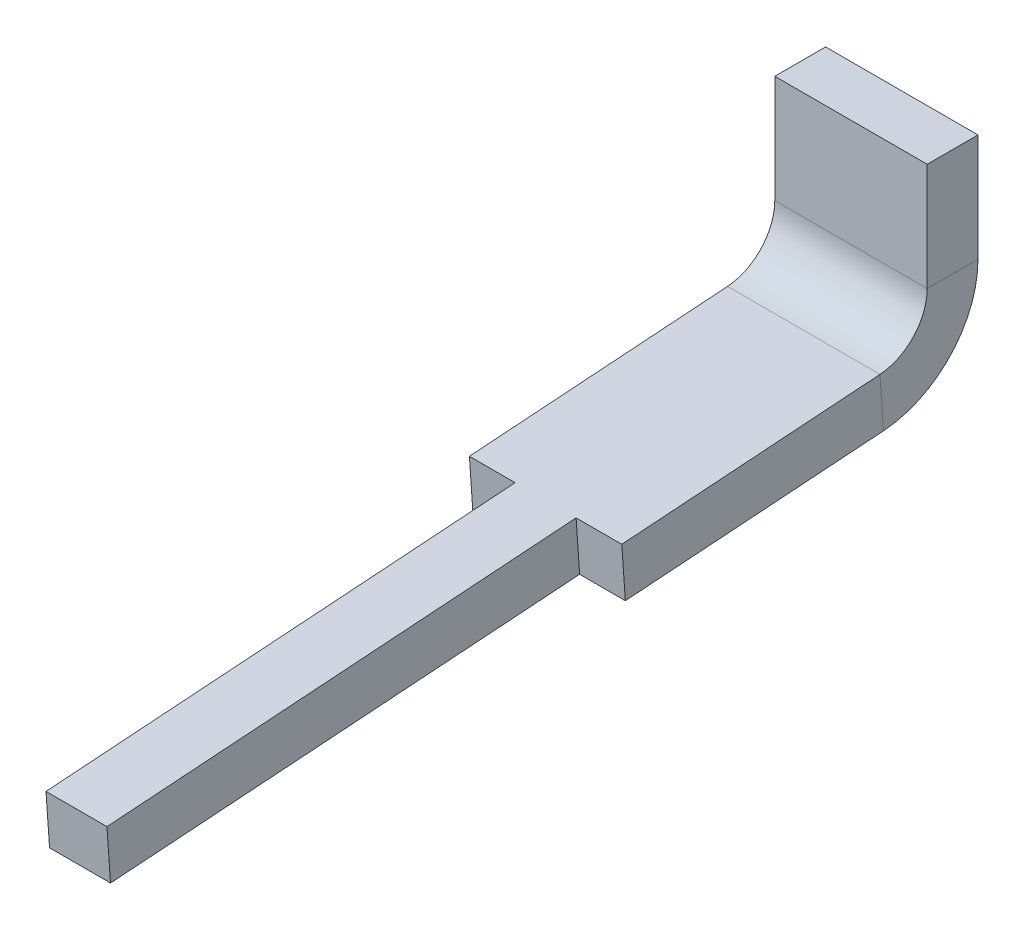
ISO-10303-21;
HEADER;
FILE_DESCRIPTION(('STEP AP214'),'2;1');
FILE_NAME('part.step','',(''),(''),'','','');
FILE_SCHEMA(('AUTOMOTIVE_DESIGN { 1 0 10303 214 1 1 1 1 }'));
ENDSEC;
DATA;
#1=APPLICATION_CONTEXT('core data for automotive mechanical design processes');
#2=APPLICATION_PROTOCOL_DEFINITION('international standard','automotive_design',2000,#1);
#3=PRODUCT_CONTEXT('',#1,'mechanical');
#4=PRODUCT('Part','Part','',(#3));
#5=PRODUCT_RELATED_PRODUCT_CATEGORY('part','',(#4));
#6=PRODUCT_DEFINITION_FORMATION('','',#4);
#7=PRODUCT_DEFINITION_CONTEXT('part definition',#1,'design');
#8=PRODUCT_DEFINITION('design','',#6,#7);
#9=PRODUCT_DEFINITION_SHAPE('','',#8);
#10=(LENGTH_UNIT() NAMED_UNIT(*) SI_UNIT(.MILLI.,.METRE.));
#11=(NAMED_UNIT(*) PLANE_ANGLE_UNIT() SI_UNIT($,.RADIAN.));
#12=(NAMED_UNIT(*) SI_UNIT($,.STERADIAN.) SOLID_ANGLE_UNIT());
#13=UNCERTAINTY_MEASURE_WITH_UNIT(LENGTH_MEASURE(1.E-05),#10,'distance_accuracy_value','');
#14=(GEOMETRIC_REPRESENTATION_CONTEXT(3) GLOBAL_UNCERTAINTY_ASSIGNED_CONTEXT((#13)) GLOBAL_UNIT_ASSIGNED_CONTEXT((#10,
#11,#12)) REPRESENTATION_CONTEXT('',''));
#15=CARTESIAN_POINT('',(0.,0.,0.));
#16=DIRECTION('',(0.,0.,1.));
#17=DIRECTION('',(1.,0.,0.));
#18=AXIS2_PLACEMENT_3D('',#15,#16,#17);
#19=CARTESIAN_POINT('',(3.88578058618805E-13,-2.2413203435652,-0.01));
#20=DIRECTION('',(0.,-1.,0.));
#21=DIRECTION('',(1.,0.,0.));
#22=AXIS2_PLACEMENT_3D('',#19,#20,#21);
#23=PLANE('',#22);
#24=DIRECTION('',(1.,0.,0.));
#25=VECTOR('',#24,1.);
#26=CARTESIAN_POINT('',(0.,-2.2413203435652,0.5));
#27=LINE('',#26,#25);
#28=CARTESIAN_POINT('',(33.1099999999967,-2.2413203435653,0.5));
#29=VERTEX_POINT('',#28);
#30=CARTESIAN_POINT('',(34.6100000000004,-2.2413203435653,0.5));
#31=VERTEX_POINT('',#30);
#32=EDGE_CURVE('E11',#29,#31,#27,.T.);
#33=ORIENTED_EDGE('',*,*,#32,.T.);
#34=DIRECTION('',(0.,0.,1.));
#35=VECTOR('',#34,1.);
#36=CARTESIAN_POINT('',(34.6100000000004,-2.2413203435653,0.5));
#37=LINE('',#36,#35);
#38=CARTESIAN_POINT('',(34.6100000000004,-2.2413203435653,0.));
#39=VERTEX_POINT('',#38);
#40=EDGE_CURVE('E24',#39,#31,#37,.T.);
#41=ORIENTED_EDGE('',*,*,#40,.F.);
#42=DIRECTION('',(1.,0.,0.));
#43=VECTOR('',#42,1.);
#44=CARTESIAN_POINT('',(0.,-2.2413203435652,0.));
#45=LINE('',#44,#43);
#46=CARTESIAN_POINT('',(33.1099999999967,-2.2413203435653,0.));
#47=VERTEX_POINT('',#46);
#48=EDGE_CURVE('E211',#47,#39,#45,.T.);
#49=ORIENTED_EDGE('',*,*,#48,.F.);
#50=DIRECTION('',(0.,0.,-1.));
#51=VECTOR('',#50,1.);
#52=CARTESIAN_POINT('',(33.1099999999967,-2.2413203435653,0.5));
#53=LINE('',#52,#51);
#54=EDGE_CURVE('E208',#29,#47,#53,.T.);
#55=ORIENTED_EDGE('',*,*,#54,.F.);
#56=EDGE_LOOP('',(#33,#41,#49,#55));
#57=FACE_BOUND('',#56,.T.);
#58=ADVANCED_FACE('F17',(#57),#23,.F.);
#59=CARTESIAN_POINT('',(33.1099999999967,0.,0.5));
#60=DIRECTION('',(1.,0.,0.));
#61=DIRECTION('',(0.,1.,0.));
#62=AXIS2_PLACEMENT_3D('',#59,#60,#61);
#63=PLANE('',#62);
#64=DIRECTION('',(0.,-1.,0.));
#65=VECTOR('',#64,1.);
#66=CARTESIAN_POINT('',(33.1099999999967,0.,0.5));
#67=LINE('',#66,#65);
#68=CARTESIAN_POINT('',(33.1099999999967,-3.3009203435652,0.5));
#69=VERTEX_POINT('',#68);
#70=EDGE_CURVE('E206',#29,#69,#67,.T.);
#71=ORIENTED_EDGE('',*,*,#70,.F.);
#72=ORIENTED_EDGE('',*,*,#54,.T.);
#73=DIRECTION('',(0.,-1.,0.));
#74=VECTOR('',#73,1.);
#75=CARTESIAN_POINT('',(33.1099999999967,0.,0.));
#76=LINE('',#75,#74);
#77=CARTESIAN_POINT('',(33.1099999999967,-3.3009203435652,0.));
#78=VERTEX_POINT('',#77);
#79=EDGE_CURVE('E204',#47,#78,#76,.T.);
#80=ORIENTED_EDGE('',*,*,#79,.T.);
#81=DIRECTION('',(0.,0.,1.));
#82=VECTOR('',#81,1.);
#83=CARTESIAN_POINT('',(33.1099999999967,-3.3009203435652,0.499999999999977));
#84=LINE('',#83,#82);
#85=EDGE_CURVE('E201',#78,#69,#84,.T.);
#86=ORIENTED_EDGE('',*,*,#85,.T.);
#87=EDGE_LOOP('',(#71,#72,#80,#86));
#88=FACE_BOUND('',#87,.T.);
#89=ADVANCED_FACE('F265',(#88),#63,.F.);
#90=CARTESIAN_POINT('',(0.,0.,0.5));
#91=DIRECTION('',(0.,0.,1.));
#92=DIRECTION('',(1.,0.,0.));
#93=AXIS2_PLACEMENT_3D('',#90,#91,#92);
#94=PLANE('',#93);
#95=ORIENTED_EDGE('',*,*,#32,.F.);
#96=ORIENTED_EDGE('',*,*,#70,.T.);
#97=DIRECTION('',(-1.,0.,0.));
#98=VECTOR('',#97,1.);
#99=CARTESIAN_POINT('',(0.,-3.3009203435652,0.5));
#100=LINE('',#99,#98);
#101=CARTESIAN_POINT('',(34.6100000000004,-3.3009203435652,0.5));
#102=VERTEX_POINT('',#101);
#103=EDGE_CURVE('E198',#102,#69,#100,.T.);
#104=ORIENTED_EDGE('',*,*,#103,.F.);
#105=DIRECTION('',(0.,1.,0.));
#106=VECTOR('',#105,1.);
#107=CARTESIAN_POINT('',(34.6100000000005,-2.41073942293827E-13,0.5));
#108=LINE('',#107,#106);
#109=EDGE_CURVE('E196',#102,#31,#108,.T.);
#110=ORIENTED_EDGE('',*,*,#109,.T.);
#111=EDGE_LOOP('',(#95,#96,#104,#110));
#112=FACE_BOUND('',#111,.T.);
#113=ADVANCED_FACE('F217',(#112),#94,.T.);
#114=CARTESIAN_POINT('',(0.,0.,0.));
#115=DIRECTION('',(0.,0.,1.));
#116=DIRECTION('',(1.,0.,0.));
#117=AXIS2_PLACEMENT_3D('',#114,#115,#116);
#118=PLANE('',#117);
#119=ORIENTED_EDGE('',*,*,#79,.F.);
#120=ORIENTED_EDGE('',*,*,#48,.T.);
#121=DIRECTION('',(0.,1.,0.));
#122=VECTOR('',#121,1.);
#123=CARTESIAN_POINT('',(34.6100000000005,-2.41073942293827E-13,0.));
#124=LINE('',#123,#122);
#125=CARTESIAN_POINT('',(34.6100000000004,-3.3009203435652,0.));
#126=VERTEX_POINT('',#125);
#127=EDGE_CURVE('E193',#126,#39,#124,.T.);
#128=ORIENTED_EDGE('',*,*,#127,.F.);
#129=DIRECTION('',(-1.,0.,0.));
#130=VECTOR('',#129,1.);
#131=CARTESIAN_POINT('',(0.,-3.3009203435652,0.));
#132=LINE('',#131,#130);
#133=EDGE_CURVE('E190',#126,#78,#132,.T.);
#134=ORIENTED_EDGE('',*,*,#133,.T.);
#135=EDGE_LOOP('',(#119,#120,#128,#134));
#136=FACE_BOUND('',#135,.T.);
#137=ADVANCED_FACE('F273',(#136),#118,.F.);
#138=CARTESIAN_POINT('',(33.1099999999967,-3.3009203435652,1.));
#139=DIRECTION('',(1.,0.,0.));
#140=DIRECTION('',(0.,0.,-1.));
#141=AXIS2_PLACEMENT_3D('',#138,#139,#140);
#142=PLANE('',#141);
#143=CARTESIAN_POINT('',(33.1099999999967,-3.3009203435652,1.));
#144=DIRECTION('',(-1.,0.,0.));
#145=DIRECTION('',(0.,0.,-1.));
#146=AXIS2_PLACEMENT_3D('',#143,#144,#145);
#147=CIRCLE('',#146,1.);
#148=CARTESIAN_POINT('',(33.1099999999967,-4.298484393825,0.930243526255876));
#149=VERTEX_POINT('',#148);
#150=EDGE_CURVE('E188',#78,#149,#147,.T.);
#151=ORIENTED_EDGE('',*,*,#150,.T.);
#152=DIRECTION('',(0.,0.997564050259824,0.0697564737441289));
#153=VECTOR('',#152,1.);
#154=CARTESIAN_POINT('',(33.1099999999967,-3.7997023686951,0.965121763127938));
#155=LINE('',#154,#153);
#156=CARTESIAN_POINT('',(33.1099999999967,-3.7997023686951,0.965121763127939));
#157=VERTEX_POINT('',#156);
#158=EDGE_CURVE('E186',#149,#157,#155,.T.);
#159=ORIENTED_EDGE('',*,*,#158,.T.);
#160=CARTESIAN_POINT('',(33.1099999999967,-3.3009203435652,1.));
#161=DIRECTION('',(-1.,0.,0.));
#162=DIRECTION('',(0.,0.,1.));
#163=AXIS2_PLACEMENT_3D('',#160,#161,#162);
#164=CIRCLE('',#163,0.5);
#165=EDGE_CURVE('E183',#69,#157,#164,.T.);
#166=ORIENTED_EDGE('',*,*,#165,.F.);
#167=ORIENTED_EDGE('',*,*,#85,.F.);
#168=EDGE_LOOP('',(#151,#159,#166,#167));
#169=FACE_BOUND('',#168,.T.);
#170=ADVANCED_FACE('F226',(#169),#142,.F.);
#171=CARTESIAN_POINT('',(34.6100000000005,-2.41073942293827E-13,0.5));
#172=DIRECTION('',(-1.,0.,0.));
#173=DIRECTION('',(0.,-1.,0.));
#174=AXIS2_PLACEMENT_3D('',#171,#172,#173);
#175=PLANE('',#174);
#176=ORIENTED_EDGE('',*,*,#127,.T.);
#177=ORIENTED_EDGE('',*,*,#40,.T.);
#178=ORIENTED_EDGE('',*,*,#109,.F.);
#179=DIRECTION('',(0.,0.,-1.));
#180=VECTOR('',#179,1.);
#181=CARTESIAN_POINT('',(34.6100000000004,-3.3009203435652,0.499999999999977));
#182=LINE('',#181,#180);
#183=EDGE_CURVE('E180',#102,#126,#182,.T.);
#184=ORIENTED_EDGE('',*,*,#183,.T.);
#185=EDGE_LOOP('',(#176,#177,#178,#184));
#186=FACE_BOUND('',#185,.T.);
#187=ADVANCED_FACE('F215',(#186),#175,.F.);
#188=CARTESIAN_POINT('',(31.9190505878091,-3.3009203435652,1.));
#189=DIRECTION('',(1.,0.,0.));
#190=DIRECTION('',(0.,0.,-1.));
#191=AXIS2_PLACEMENT_3D('',#188,#189,#190);
#192=CYLINDRICAL_SURFACE('',#191,1.);
#193=ORIENTED_EDGE('',*,*,#133,.F.);
#194=CARTESIAN_POINT('',(34.6100000000004,-3.3009203435652,1.));
#195=DIRECTION('',(1.,0.,0.));
#196=DIRECTION('',(0.,0.,-1.));
#197=AXIS2_PLACEMENT_3D('',#194,#195,#196);
#198=CIRCLE('',#197,1.);
#199=CARTESIAN_POINT('',(34.6100000000004,-4.298484393825,0.930243526255876));
#200=VERTEX_POINT('',#199);
#201=EDGE_CURVE('E177',#200,#126,#198,.T.);
#202=ORIENTED_EDGE('',*,*,#201,.F.);
#203=DIRECTION('',(-1.,0.,0.));
#204=VECTOR('',#203,1.);
#205=CARTESIAN_POINT('',(0.,-4.298484393825,0.930243526255876));
#206=LINE('',#205,#204);
#207=EDGE_CURVE('E174',#200,#149,#206,.T.);
#208=ORIENTED_EDGE('',*,*,#207,.T.);
#209=ORIENTED_EDGE('',*,*,#150,.F.);
#210=EDGE_LOOP('',(#193,#202,#208,#209));
#211=FACE_BOUND('',#210,.T.);
#212=ADVANCED_FACE('F236',(#211),#192,.T.);
#213=CARTESIAN_POINT('',(34.6100000000004,-3.3009203435652,1.));
#214=DIRECTION('',(-1.,0.,0.));
#215=DIRECTION('',(0.,0.,1.));
#216=AXIS2_PLACEMENT_3D('',#213,#214,#215);
#217=PLANE('',#216);
#218=DIRECTION('',(0.,-0.997564050259824,-0.0697564737441289));
#219=VECTOR('',#218,1.);
#220=CARTESIAN_POINT('',(34.6100000000004,-3.7997023686951,0.965121763127938));
#221=LINE('',#220,#219);
#222=CARTESIAN_POINT('',(34.6100000000004,-3.7997023686951,0.965121763127938));
#223=VERTEX_POINT('',#222);
#224=EDGE_CURVE('E171',#223,#200,#221,.T.);
#225=ORIENTED_EDGE('',*,*,#224,.T.);
#226=ORIENTED_EDGE('',*,*,#201,.T.);
#227=ORIENTED_EDGE('',*,*,#183,.F.);
#228=CARTESIAN_POINT('',(34.6100000000004,-3.3009203435652,1.));
#229=DIRECTION('',(1.,0.,0.));
#230=DIRECTION('',(0.,0.,-1.));
#231=AXIS2_PLACEMENT_3D('',#228,#229,#230);
#232=CIRCLE('',#231,0.5);
#233=EDGE_CURVE('E168',#223,#102,#232,.T.);
#234=ORIENTED_EDGE('',*,*,#233,.F.);
#235=EDGE_LOOP('',(#225,#226,#227,#234));
#236=FACE_BOUND('',#235,.T.);
#237=ADVANCED_FACE('F254',(#236),#217,.F.);
#238=CARTESIAN_POINT('',(31.9190505878091,-3.3009203435652,1.));
#239=DIRECTION('',(1.,0.,0.));
#240=DIRECTION('',(0.,0.,-1.));
#241=AXIS2_PLACEMENT_3D('',#238,#239,#240);
#242=CYLINDRICAL_SURFACE('',#241,0.5);
#243=ORIENTED_EDGE('',*,*,#103,.T.);
#244=ORIENTED_EDGE('',*,*,#165,.T.);
#245=DIRECTION('',(-1.,0.,0.));
#246=VECTOR('',#245,1.);
#247=CARTESIAN_POINT('',(0.,-3.7997023686951,0.965121763127941));
#248=LINE('',#247,#246);
#249=EDGE_CURVE('E165',#223,#157,#248,.T.);
#250=ORIENTED_EDGE('',*,*,#249,.F.);
#251=ORIENTED_EDGE('',*,*,#233,.T.);
#252=EDGE_LOOP('',(#243,#244,#250,#251));
#253=FACE_BOUND('',#252,.T.);
#254=ADVANCED_FACE('F221',(#253),#242,.F.);
#255=CARTESIAN_POINT('',(33.1099999999967,-3.4909143362964,-3.4507528322723));
#256=DIRECTION('',(1.,0.,0.));
#257=DIRECTION('',(0.,0.0697564737441219,-0.997564050259825));
#258=AXIS2_PLACEMENT_3D('',#255,#256,#257);
#259=PLANE('',#258);
#260=ORIENTED_EDGE('',*,*,#158,.F.);
#261=DIRECTION('',(0.,-0.0697564737441219,0.997564050259824));
#262=VECTOR('',#261,1.);
#263=CARTESIAN_POINT('',(33.1099999999967,-3.9896963614263,-3.4856310691444));
#264=LINE('',#263,#262);
#265=CARTESIAN_POINT('',(33.1099999999967,-4.4761305988812,3.470702616536));
#266=VERTEX_POINT('',#265);
#267=EDGE_CURVE('E163',#149,#266,#264,.T.);
#268=ORIENTED_EDGE('',*,*,#267,.T.);
#269=DIRECTION('',(0.,-0.997564050259824,-0.0697564737441219));
#270=VECTOR('',#269,1.);
#271=CARTESIAN_POINT('',(33.1099999999967,-3.9773485737513,3.505580853408));
#272=LINE('',#271,#270);
#273=CARTESIAN_POINT('',(33.1099999999967,-3.9773485737513,3.505580853408));
#274=VERTEX_POINT('',#273);
#275=EDGE_CURVE('E160',#274,#266,#272,.T.);
#276=ORIENTED_EDGE('',*,*,#275,.F.);
#277=DIRECTION('',(0.,-0.0697564737441219,0.997564050259824));
#278=VECTOR('',#277,1.);
#279=CARTESIAN_POINT('',(33.1099999999967,-3.4909143362964,-3.4507528322723));
#280=LINE('',#279,#278);
#281=EDGE_CURVE('E157',#157,#274,#280,.T.);
#282=ORIENTED_EDGE('',*,*,#281,.F.);
#283=EDGE_LOOP('',(#260,#268,#276,#282));
#284=FACE_BOUND('',#283,.T.);
#285=ADVANCED_FACE('F231',(#284),#259,.F.);
#286=CARTESIAN_POINT('',(0.,-3.9896963614263,-3.4856310691444));
#287=DIRECTION('',(0.,0.997564050259825,0.0697564737441219));
#288=DIRECTION('',(1.,0.,0.));
#289=AXIS2_PLACEMENT_3D('',#286,#287,#288);
#290=PLANE('',#289);
#291=ORIENTED_EDGE('',*,*,#207,.F.);
#292=DIRECTION('',(0.,0.0697564737441219,-0.997564050259824));
#293=VECTOR('',#292,1.);
#294=CARTESIAN_POINT('',(34.6100000000005,-3.9896963614264,-3.4856310691442));
#295=LINE('',#294,#293);
#296=CARTESIAN_POINT('',(34.6100000000004,-4.4761305988812,3.470702616536));
#297=VERTEX_POINT('',#296);
#298=EDGE_CURVE('E154',#297,#200,#295,.T.);
#299=ORIENTED_EDGE('',*,*,#298,.F.);
#300=DIRECTION('',(1.,0.,0.));
#301=VECTOR('',#300,1.);
#302=CARTESIAN_POINT('',(0.,-4.4761305988812,3.470702616536));
#303=LINE('',#302,#301);
#304=CARTESIAN_POINT('',(34.1599999999976,-4.4761305988812,3.470702616536));
#305=VERTEX_POINT('',#304);
#306=EDGE_CURVE('E152',#305,#297,#303,.T.);
#307=ORIENTED_EDGE('',*,*,#306,.F.);
#308=DIRECTION('',(0.,0.0697564737441219,-0.997564050259824));
#309=VECTOR('',#308,1.);
#310=CARTESIAN_POINT('',(34.1599999999976,-3.9896963614263,-3.4856310691444));
#311=LINE('',#310,#309);
#312=CARTESIAN_POINT('',(34.1599999999976,-4.7989635593689,8.0874290411376));
#313=VERTEX_POINT('',#312);
#314=EDGE_CURVE('E125',#313,#305,#311,.T.);
#315=ORIENTED_EDGE('',*,*,#314,.F.);
#316=DIRECTION('',(1.,0.,0.));
#317=VECTOR('',#316,1.);
#318=CARTESIAN_POINT('',(0.,-4.7989635593689,8.0874290411376));
#319=LINE('',#318,#317);
#320=CARTESIAN_POINT('',(33.5599999999996,-4.7989635593689,8.0874290411376));
#321=VERTEX_POINT('',#320);
#322=EDGE_CURVE('E148',#321,#313,#319,.T.);
#323=ORIENTED_EDGE('',*,*,#322,.F.);
#324=DIRECTION('',(0.,-0.0697564737441219,0.997564050259824));
#325=VECTOR('',#324,1.);
#326=CARTESIAN_POINT('',(33.5599999999996,-3.9896963614263,-3.4856310691444));
#327=LINE('',#326,#325);
#328=CARTESIAN_POINT('',(33.5599999999996,-4.4761305988812,3.470702616536));
#329=VERTEX_POINT('',#328);
#330=EDGE_CURVE('E145',#329,#321,#327,.T.);
#331=ORIENTED_EDGE('',*,*,#330,.F.);
#332=DIRECTION('',(1.,0.,0.));
#333=VECTOR('',#332,1.);
#334=CARTESIAN_POINT('',(0.,-4.4761305988812,3.470702616536));
#335=LINE('',#334,#333);
#336=EDGE_CURVE('E142',#266,#329,#335,.T.);
#337=ORIENTED_EDGE('',*,*,#336,.F.);
#338=ORIENTED_EDGE('',*,*,#267,.F.);
#339=EDGE_LOOP('',(#291,#299,#307,#315,#323,#331,#337,#338));
#340=FACE_BOUND('',#339,.T.);
#341=ADVANCED_FACE('F239',(#340),#290,.F.);
#342=CARTESIAN_POINT('',(34.6100000000005,-3.4909143362964,-3.4507528322721));
#343=DIRECTION('',(-1.,0.,0.));
#344=DIRECTION('',(0.,-0.0697564737441219,0.997564050259825));
#345=AXIS2_PLACEMENT_3D('',#342,#343,#344);
#346=PLANE('',#345);
#347=ORIENTED_EDGE('',*,*,#224,.F.);
#348=DIRECTION('',(0.,0.0697564737441219,-0.997564050259824));
#349=VECTOR('',#348,1.);
#350=CARTESIAN_POINT('',(34.6100000000005,-3.4909143362964,-3.4507528322721));
#351=LINE('',#350,#349);
#352=CARTESIAN_POINT('',(34.6100000000004,-3.9773485737513,3.505580853408));
#353=VERTEX_POINT('',#352);
#354=EDGE_CURVE('E140',#353,#223,#351,.T.);
#355=ORIENTED_EDGE('',*,*,#354,.F.);
#356=DIRECTION('',(0.,-0.997564050259824,-0.0697564737441219));
#357=VECTOR('',#356,1.);
#358=CARTESIAN_POINT('',(34.6100000000004,-3.9773485737513,3.505580853408));
#359=LINE('',#358,#357);
#360=EDGE_CURVE('E120',#353,#297,#359,.T.);
#361=ORIENTED_EDGE('',*,*,#360,.T.);
#362=ORIENTED_EDGE('',*,*,#298,.T.);
#363=EDGE_LOOP('',(#347,#355,#361,#362));
#364=FACE_BOUND('',#363,.T.);
#365=ADVANCED_FACE('F252',(#364),#346,.F.);
#366=CARTESIAN_POINT('',(0.,-3.4909143362964,-3.4507528322724));
#367=DIRECTION('',(0.,0.997564050259825,0.0697564737441219));
#368=DIRECTION('',(1.,0.,0.));
#369=AXIS2_PLACEMENT_3D('',#366,#367,#368);
#370=PLANE('',#369);
#371=ORIENTED_EDGE('',*,*,#354,.T.);
#372=ORIENTED_EDGE('',*,*,#249,.T.);
#373=ORIENTED_EDGE('',*,*,#281,.T.);
#374=DIRECTION('',(1.,0.,0.));
#375=VECTOR('',#374,1.);
#376=CARTESIAN_POINT('',(0.,-3.9773485737513,3.505580853408));
#377=LINE('',#376,#375);
#378=CARTESIAN_POINT('',(33.5599999999996,-3.9773485737513,3.505580853408));
#379=VERTEX_POINT('',#378);
#380=EDGE_CURVE('E137',#274,#379,#377,.T.);
#381=ORIENTED_EDGE('',*,*,#380,.T.);
#382=DIRECTION('',(0.,-0.0697564737441219,0.997564050259824));
#383=VECTOR('',#382,1.);
#384=CARTESIAN_POINT('',(33.5599999999996,-3.4909143362964,-3.4507528322724));
#385=LINE('',#384,#383);
#386=CARTESIAN_POINT('',(33.5599999999996,-4.300181534239,8.1223072780096));
#387=VERTEX_POINT('',#386);
#388=EDGE_CURVE('E135',#379,#387,#385,.T.);
#389=ORIENTED_EDGE('',*,*,#388,.T.);
#390=DIRECTION('',(1.,0.,0.));
#391=VECTOR('',#390,1.);
#392=CARTESIAN_POINT('',(0.,-4.300181534239,8.1223072780096));
#393=LINE('',#392,#391);
#394=CARTESIAN_POINT('',(34.1599999999976,-4.300181534239,8.1223072780096));
#395=VERTEX_POINT('',#394);
#396=EDGE_CURVE('E107',#387,#395,#393,.T.);
#397=ORIENTED_EDGE('',*,*,#396,.T.);
#398=DIRECTION('',(0.,0.0697564737441219,-0.997564050259824));
#399=VECTOR('',#398,1.);
#400=CARTESIAN_POINT('',(34.1599999999976,-3.4909143362964,-3.4507528322724));
#401=LINE('',#400,#399);
#402=CARTESIAN_POINT('',(34.1599999999976,-3.9773485737513,3.505580853408));
#403=VERTEX_POINT('',#402);
#404=EDGE_CURVE('E101',#395,#403,#401,.T.);
#405=ORIENTED_EDGE('',*,*,#404,.T.);
#406=DIRECTION('',(1.,0.,0.));
#407=VECTOR('',#406,1.);
#408=CARTESIAN_POINT('',(0.,-3.9773485737513,3.505580853408));
#409=LINE('',#408,#407);
#410=EDGE_CURVE('E105',#403,#353,#409,.T.);
#411=ORIENTED_EDGE('',*,*,#410,.T.);
#412=EDGE_LOOP('',(#371,#372,#373,#381,#389,#397,#405,#411));
#413=FACE_BOUND('',#412,.T.);
#414=ADVANCED_FACE('F104',(#413),#370,.T.);
#415=CARTESIAN_POINT('',(0.,-3.9773485737513,3.505580853408));
#416=DIRECTION('',(0.,0.0697564737441219,-0.997564050259825));
#417=DIRECTION('',(0.,0.997564050259825,0.0697564737441219));
#418=AXIS2_PLACEMENT_3D('',#415,#416,#417);
#419=PLANE('',#418);
#420=ORIENTED_EDGE('',*,*,#336,.T.);
#421=DIRECTION('',(0.,-0.997564050259824,-0.0697564737441219));
#422=VECTOR('',#421,1.);
#423=CARTESIAN_POINT('',(33.5599999999996,-3.9773485737513,3.505580853408));
#424=LINE('',#423,#422);
#425=EDGE_CURVE('E121',#379,#329,#424,.T.);
#426=ORIENTED_EDGE('',*,*,#425,.F.);
#427=ORIENTED_EDGE('',*,*,#380,.F.);
#428=ORIENTED_EDGE('',*,*,#275,.T.);
#429=EDGE_LOOP('',(#420,#426,#427,#428));
#430=FACE_BOUND('',#429,.T.);
#431=ADVANCED_FACE('F242',(#430),#419,.F.);
#432=CARTESIAN_POINT('',(0.,-3.9773485737513,3.505580853408));
#433=DIRECTION('',(0.,0.0697564737441219,-0.997564050259825));
#434=DIRECTION('',(0.,0.997564050259825,0.0697564737441219));
#435=AXIS2_PLACEMENT_3D('',#432,#433,#434);
#436=PLANE('',#435);
#437=ORIENTED_EDGE('',*,*,#306,.T.);
#438=ORIENTED_EDGE('',*,*,#360,.F.);
#439=ORIENTED_EDGE('',*,*,#410,.F.);
#440=DIRECTION('',(0.,-0.997564050259824,-0.0697564737441219));
#441=VECTOR('',#440,1.);
#442=CARTESIAN_POINT('',(34.1599999999976,-3.9773485737513,3.505580853408));
#443=LINE('',#442,#441);
#444=EDGE_CURVE('E118',#403,#305,#443,.T.);
#445=ORIENTED_EDGE('',*,*,#444,.T.);
#446=EDGE_LOOP('',(#437,#438,#439,#445));
#447=FACE_BOUND('',#446,.T.);
#448=ADVANCED_FACE('F117',(#447),#436,.F.);
#449=CARTESIAN_POINT('',(34.1599999999976,-3.4909143362964,-3.4507528322724));
#450=DIRECTION('',(-1.,0.,0.));
#451=DIRECTION('',(0.,0.997564050259825,0.0697564737441219));
#452=AXIS2_PLACEMENT_3D('',#449,#450,#451);
#453=PLANE('',#452);
#454=ORIENTED_EDGE('',*,*,#314,.T.);
#455=ORIENTED_EDGE('',*,*,#444,.F.);
#456=ORIENTED_EDGE('',*,*,#404,.F.);
#457=DIRECTION('',(0.,-0.997564050259824,-0.0697564737441219));
#458=VECTOR('',#457,1.);
#459=CARTESIAN_POINT('',(34.1599999999976,-4.300181534239,8.1223072780096));
#460=LINE('',#459,#458);
#461=EDGE_CURVE('E126',#395,#313,#460,.T.);
#462=ORIENTED_EDGE('',*,*,#461,.T.);
#463=EDGE_LOOP('',(#454,#455,#456,#462));
#464=FACE_BOUND('',#463,.T.);
#465=ADVANCED_FACE('F124',(#464),#453,.F.);
#466=CARTESIAN_POINT('',(0.,-4.300181534239,8.1223072780096));
#467=DIRECTION('',(0.,0.0697564737441219,-0.997564050259825));
#468=DIRECTION('',(0.,0.997564050259825,0.0697564737441219));
#469=AXIS2_PLACEMENT_3D('',#466,#467,#468);
#470=PLANE('',#469);
#471=ORIENTED_EDGE('',*,*,#322,.T.);
#472=ORIENTED_EDGE('',*,*,#461,.F.);
#473=ORIENTED_EDGE('',*,*,#396,.F.);
#474=DIRECTION('',(0.,-0.997564050259824,-0.0697564737441219));
#475=VECTOR('',#474,1.);
#476=CARTESIAN_POINT('',(33.5599999999996,-4.300181534239,8.1223072780096));
#477=LINE('',#476,#475);
#478=EDGE_CURVE('E130',#387,#321,#477,.T.);
#479=ORIENTED_EDGE('',*,*,#478,.T.);
#480=EDGE_LOOP('',(#471,#472,#473,#479));
#481=FACE_BOUND('',#480,.T.);
#482=ADVANCED_FACE('F250',(#481),#470,.F.);
#483=CARTESIAN_POINT('',(33.5599999999996,-3.4909143362964,-3.4507528322724));
#484=DIRECTION('',(1.,0.,0.));
#485=DIRECTION('',(0.,-0.997564050259825,-0.0697564737441219));
#486=AXIS2_PLACEMENT_3D('',#483,#484,#485);
#487=PLANE('',#486);
#488=ORIENTED_EDGE('',*,*,#330,.T.);
#489=ORIENTED_EDGE('',*,*,#478,.F.);
#490=ORIENTED_EDGE('',*,*,#388,.F.);
#491=ORIENTED_EDGE('',*,*,#425,.T.);
#492=EDGE_LOOP('',(#488,#489,#490,#491));
#493=FACE_BOUND('',#492,.T.);
#494=ADVANCED_FACE('F246',(#493),#487,.F.);
#495=CLOSED_SHELL('',(#58,#89,#113,#137,#170,#187,#212,#237,#254,#285,#341,#365,#414,#431,#448,
#465,#482,#494));
#496=MANIFOLD_SOLID_BREP('B1',#495);
#497=ADVANCED_BREP_SHAPE_REPRESENTATION('',(#18,#496),#14);
#498=SHAPE_DEFINITION_REPRESENTATION(#9,#497);
ENDSEC;
END-ISO-10303-21;
